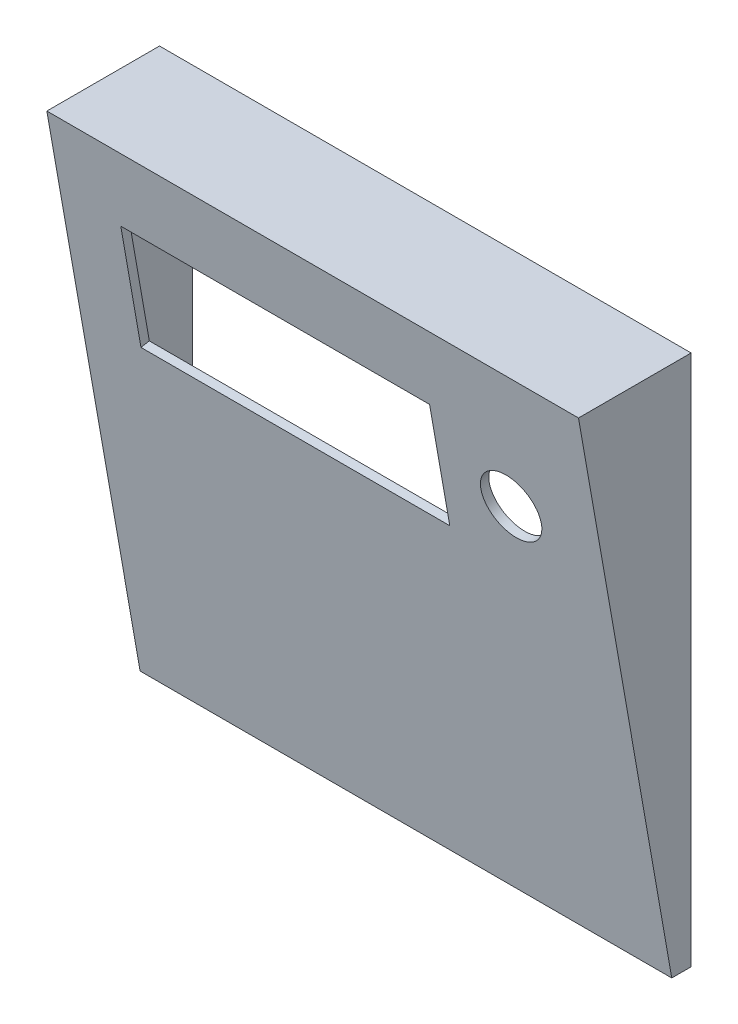
ISO-10303-21;
HEADER;
FILE_DESCRIPTION(('STEP AP214'),'2;1');
FILE_NAME('part.step','',(''),(''),'','','');
FILE_SCHEMA(('AUTOMOTIVE_DESIGN { 1 0 10303 214 1 1 1 1 }'));
ENDSEC;
DATA;
#1=APPLICATION_CONTEXT('core data for automotive mechanical design processes');
#2=APPLICATION_PROTOCOL_DEFINITION('international standard','automotive_design',2000,#1);
#3=PRODUCT_CONTEXT('',#1,'mechanical');
#4=PRODUCT('Part','Part','',(#3));
#5=PRODUCT_RELATED_PRODUCT_CATEGORY('part','',(#4));
#6=PRODUCT_DEFINITION_FORMATION('','',#4);
#7=PRODUCT_DEFINITION_CONTEXT('part definition',#1,'design');
#8=PRODUCT_DEFINITION('design','',#6,#7);
#9=PRODUCT_DEFINITION_SHAPE('','',#8);
#10=(LENGTH_UNIT() NAMED_UNIT(*) SI_UNIT(.MILLI.,.METRE.));
#11=(NAMED_UNIT(*) PLANE_ANGLE_UNIT() SI_UNIT($,.RADIAN.));
#12=(NAMED_UNIT(*) SI_UNIT($,.STERADIAN.) SOLID_ANGLE_UNIT());
#13=UNCERTAINTY_MEASURE_WITH_UNIT(LENGTH_MEASURE(1.E-05),#10,'distance_accuracy_value','');
#14=(GEOMETRIC_REPRESENTATION_CONTEXT(3) GLOBAL_UNCERTAINTY_ASSIGNED_CONTEXT((#13)) GLOBAL_UNIT_ASSIGNED_CONTEXT((#10,
#11,#12)) REPRESENTATION_CONTEXT('',''));
#15=CARTESIAN_POINT('',(0.,0.,0.));
#16=DIRECTION('',(0.,0.,1.));
#17=DIRECTION('',(1.,0.,0.));
#18=AXIS2_PLACEMENT_3D('',#15,#16,#17);
#19=CARTESIAN_POINT('',(0.,0.,20.));
#20=DIRECTION('',(1.,0.,0.));
#21=DIRECTION('',(0.,0.,-1.));
#22=AXIS2_PLACEMENT_3D('',#19,#20,#21);
#23=PLANE('',#22);
#24=DIRECTION('',(0.,0.,-1.));
#25=VECTOR('',#24,1.);
#26=CARTESIAN_POINT('',(0.,0.,20.));
#27=LINE('',#26,#25);
#28=CARTESIAN_POINT('',(0.,0.,4.6));
#29=VERTEX_POINT('',#28);
#30=CARTESIAN_POINT('',(0.,0.,1.4));
#31=VERTEX_POINT('',#30);
#32=EDGE_CURVE('E266',#29,#31,#27,.T.);
#33=ORIENTED_EDGE('',*,*,#32,.F.);
#34=DIRECTION('',(0.,0.984963723377923,0.172761290888611));
#35=VECTOR('',#34,1.);
#36=CARTESIAN_POINT('',(0.,87.8,20.));
#37=LINE('',#36,#35);
#38=CARTESIAN_POINT('',(0.,87.8,20.));
#39=VERTEX_POINT('',#38);
#40=EDGE_CURVE('E207',#29,#39,#37,.T.);
#41=ORIENTED_EDGE('',*,*,#40,.T.);
#42=DIRECTION('',(0.,0.,-1.));
#43=VECTOR('',#42,1.);
#44=CARTESIAN_POINT('',(0.,87.8,20.));
#45=LINE('',#44,#43);
#46=CARTESIAN_POINT('',(0.,87.8,1.4));
#47=VERTEX_POINT('',#46);
#48=EDGE_CURVE('E258',#39,#47,#45,.T.);
#49=ORIENTED_EDGE('',*,*,#48,.T.);
#50=DIRECTION('',(0.,1.,0.));
#51=VECTOR('',#50,1.);
#52=CARTESIAN_POINT('',(0.,87.8,1.4));
#53=LINE('',#52,#51);
#54=EDGE_CURVE('E252',#31,#47,#53,.T.);
#55=ORIENTED_EDGE('',*,*,#54,.F.);
#56=EDGE_LOOP('',(#33,#41,#49,#55));
#57=FACE_BOUND('',#56,.T.);
#58=ADVANCED_FACE('F35',(#57),#23,.F.);
#59=CARTESIAN_POINT('',(0.,0.,20.));
#60=DIRECTION('',(0.,1.,0.));
#61=DIRECTION('',(0.,0.,1.));
#62=AXIS2_PLACEMENT_3D('',#59,#60,#61);
#63=PLANE('',#62);
#64=DIRECTION('',(0.,0.,-1.));
#65=VECTOR('',#64,1.);
#66=CARTESIAN_POINT('',(87.8,0.,20.));
#67=LINE('',#66,#65);
#68=CARTESIAN_POINT('',(87.8,0.,4.6));
#69=VERTEX_POINT('',#68);
#70=CARTESIAN_POINT('',(87.8,0.,1.4));
#71=VERTEX_POINT('',#70);
#72=EDGE_CURVE('E264',#69,#71,#67,.T.);
#73=ORIENTED_EDGE('',*,*,#72,.F.);
#74=DIRECTION('',(1.,0.,0.));
#75=VECTOR('',#74,1.);
#76=CARTESIAN_POINT('',(0.,0.,4.6));
#77=LINE('',#76,#75);
#78=EDGE_CURVE('E210',#29,#69,#77,.T.);
#79=ORIENTED_EDGE('',*,*,#78,.F.);
#80=ORIENTED_EDGE('',*,*,#32,.T.);
#81=DIRECTION('',(-1.,0.,0.));
#82=VECTOR('',#81,1.);
#83=CARTESIAN_POINT('',(87.8,0.,1.4));
#84=LINE('',#83,#82);
#85=EDGE_CURVE('E249',#71,#31,#84,.T.);
#86=ORIENTED_EDGE('',*,*,#85,.F.);
#87=EDGE_LOOP('',(#73,#79,#80,#86));
#88=FACE_BOUND('',#87,.T.);
#89=ADVANCED_FACE('F293',(#88),#63,.F.);
#90=CARTESIAN_POINT('',(87.8,0.,20.));
#91=DIRECTION('',(-1.,0.,0.));
#92=DIRECTION('',(0.,0.,1.));
#93=AXIS2_PLACEMENT_3D('',#90,#91,#92);
#94=PLANE('',#93);
#95=DIRECTION('',(0.,0.,-1.));
#96=VECTOR('',#95,1.);
#97=CARTESIAN_POINT('',(87.8,87.8,20.));
#98=LINE('',#97,#96);
#99=CARTESIAN_POINT('',(87.8,87.8,20.));
#100=VERTEX_POINT('',#99);
#101=CARTESIAN_POINT('',(87.8,87.8,1.4));
#102=VERTEX_POINT('',#101);
#103=EDGE_CURVE('E261',#100,#102,#98,.T.);
#104=ORIENTED_EDGE('',*,*,#103,.F.);
#105=DIRECTION('',(0.,0.984963723377923,0.172761290888611));
#106=VECTOR('',#105,1.);
#107=CARTESIAN_POINT('',(87.8,87.8,20.));
#108=LINE('',#107,#106);
#109=EDGE_CURVE('E206',#69,#100,#108,.T.);
#110=ORIENTED_EDGE('',*,*,#109,.F.);
#111=ORIENTED_EDGE('',*,*,#72,.T.);
#112=DIRECTION('',(0.,-1.,0.));
#113=VECTOR('',#112,1.);
#114=CARTESIAN_POINT('',(87.8,87.8,1.4));
#115=LINE('',#114,#113);
#116=EDGE_CURVE('E240',#102,#71,#115,.T.);
#117=ORIENTED_EDGE('',*,*,#116,.F.);
#118=EDGE_LOOP('',(#104,#110,#111,#117));
#119=FACE_BOUND('',#118,.T.);
#120=ADVANCED_FACE('F298',(#119),#94,.F.);
#121=CARTESIAN_POINT('',(0.,87.8,20.));
#122=DIRECTION('',(0.,-1.,0.));
#123=DIRECTION('',(0.,0.,-1.));
#124=AXIS2_PLACEMENT_3D('',#121,#122,#123);
#125=PLANE('',#124);
#126=DIRECTION('',(1.,0.,0.));
#127=VECTOR('',#126,1.);
#128=CARTESIAN_POINT('',(87.8,87.8,1.4));
#129=LINE('',#128,#127);
#130=EDGE_CURVE('E254',#47,#102,#129,.T.);
#131=ORIENTED_EDGE('',*,*,#130,.F.);
#132=ORIENTED_EDGE('',*,*,#48,.F.);
#133=DIRECTION('',(-1.,0.,0.));
#134=VECTOR('',#133,1.);
#135=CARTESIAN_POINT('',(0.,87.8,20.));
#136=LINE('',#135,#134);
#137=EDGE_CURVE('E256',#100,#39,#136,.T.);
#138=ORIENTED_EDGE('',*,*,#137,.F.);
#139=ORIENTED_EDGE('',*,*,#103,.T.);
#140=EDGE_LOOP('',(#131,#132,#138,#139));
#141=FACE_BOUND('',#140,.T.);
#142=ADVANCED_FACE('F315',(#141),#125,.F.);
#143=CARTESIAN_POINT('',(0.,0.,1.4));
#144=DIRECTION('',(0.,0.,-1.));
#145=DIRECTION('',(-1.,0.,0.));
#146=AXIS2_PLACEMENT_3D('',#143,#144,#145);
#147=PLANE('',#146);
#148=DIRECTION('',(1.,0.,0.));
#149=VECTOR('',#148,1.);
#150=CARTESIAN_POINT('',(86.15,86.15,1.4));
#151=LINE('',#150,#149);
#152=CARTESIAN_POINT('',(1.65,86.15,1.4));
#153=VERTEX_POINT('',#152);
#154=CARTESIAN_POINT('',(86.15,86.15,1.4));
#155=VERTEX_POINT('',#154);
#156=EDGE_CURVE('E224',#153,#155,#151,.T.);
#157=ORIENTED_EDGE('',*,*,#156,.F.);
#158=DIRECTION('',(0.,1.,0.));
#159=VECTOR('',#158,1.);
#160=CARTESIAN_POINT('',(1.65,86.15,1.4));
#161=LINE('',#160,#159);
#162=CARTESIAN_POINT('',(1.65,1.65,1.4));
#163=VERTEX_POINT('',#162);
#164=EDGE_CURVE('E221',#163,#153,#161,.T.);
#165=ORIENTED_EDGE('',*,*,#164,.F.);
#166=DIRECTION('',(-1.,0.,0.));
#167=VECTOR('',#166,1.);
#168=CARTESIAN_POINT('',(86.15,1.65,1.4));
#169=LINE('',#168,#167);
#170=CARTESIAN_POINT('',(86.15,1.65,1.4));
#171=VERTEX_POINT('',#170);
#172=EDGE_CURVE('E217',#171,#163,#169,.T.);
#173=ORIENTED_EDGE('',*,*,#172,.F.);
#174=DIRECTION('',(0.,-1.,0.));
#175=VECTOR('',#174,1.);
#176=CARTESIAN_POINT('',(86.15,86.15,1.4));
#177=LINE('',#176,#175);
#178=EDGE_CURVE('E214',#155,#171,#177,.T.);
#179=ORIENTED_EDGE('',*,*,#178,.F.);
#180=EDGE_LOOP('',(#157,#165,#173,#179));
#181=FACE_BOUND('',#180,.T.);
#182=ORIENTED_EDGE('',*,*,#116,.T.);
#183=ORIENTED_EDGE('',*,*,#85,.T.);
#184=ORIENTED_EDGE('',*,*,#54,.T.);
#185=ORIENTED_EDGE('',*,*,#130,.T.);
#186=EDGE_LOOP('',(#182,#183,#184,#185));
#187=FACE_BOUND('',#186,.T.);
#188=ADVANCED_FACE('F307',(#181,#187),#147,.T.);
#189=CARTESIAN_POINT('',(86.15,86.15,1.4));
#190=DIRECTION('',(1.,0.,0.));
#191=DIRECTION('',(0.,0.,-1.));
#192=AXIS2_PLACEMENT_3D('',#189,#190,#191);
#193=PLANE('',#192);
#194=DIRECTION('',(0.,-1.,0.));
#195=VECTOR('',#194,1.);
#196=CARTESIAN_POINT('',(86.15,86.15,0.));
#197=LINE('',#196,#195);
#198=CARTESIAN_POINT('',(86.15,86.15,0.));
#199=VERTEX_POINT('',#198);
#200=CARTESIAN_POINT('',(86.15,1.65,0.));
#201=VERTEX_POINT('',#200);
#202=EDGE_CURVE('E213',#199,#201,#197,.T.);
#203=ORIENTED_EDGE('',*,*,#202,.F.);
#204=DIRECTION('',(0.,0.,-1.));
#205=VECTOR('',#204,1.);
#206=CARTESIAN_POINT('',(86.15,86.15,1.4));
#207=LINE('',#206,#205);
#208=EDGE_CURVE('E238',#155,#199,#207,.T.);
#209=ORIENTED_EDGE('',*,*,#208,.F.);
#210=ORIENTED_EDGE('',*,*,#178,.T.);
#211=DIRECTION('',(0.,0.,-1.));
#212=VECTOR('',#211,1.);
#213=CARTESIAN_POINT('',(86.15,1.65,1.4));
#214=LINE('',#213,#212);
#215=EDGE_CURVE('E227',#171,#201,#214,.T.);
#216=ORIENTED_EDGE('',*,*,#215,.T.);
#217=EDGE_LOOP('',(#203,#209,#210,#216));
#218=FACE_BOUND('',#217,.T.);
#219=ADVANCED_FACE('F339',(#218),#193,.T.);
#220=CARTESIAN_POINT('',(86.15,86.15,1.4));
#221=DIRECTION('',(0.,1.,0.));
#222=DIRECTION('',(0.,0.,1.));
#223=AXIS2_PLACEMENT_3D('',#220,#221,#222);
#224=PLANE('',#223);
#225=DIRECTION('',(1.,0.,0.));
#226=VECTOR('',#225,1.);
#227=CARTESIAN_POINT('',(86.15,86.15,0.));
#228=LINE('',#227,#226);
#229=CARTESIAN_POINT('',(1.65,86.15,0.));
#230=VERTEX_POINT('',#229);
#231=EDGE_CURVE('E218',#230,#199,#228,.T.);
#232=ORIENTED_EDGE('',*,*,#231,.F.);
#233=DIRECTION('',(0.,0.,-1.));
#234=VECTOR('',#233,1.);
#235=CARTESIAN_POINT('',(1.65,86.15,1.4));
#236=LINE('',#235,#234);
#237=EDGE_CURVE('E241',#153,#230,#236,.T.);
#238=ORIENTED_EDGE('',*,*,#237,.F.);
#239=ORIENTED_EDGE('',*,*,#156,.T.);
#240=ORIENTED_EDGE('',*,*,#208,.T.);
#241=EDGE_LOOP('',(#232,#238,#239,#240));
#242=FACE_BOUND('',#241,.T.);
#243=ADVANCED_FACE('F335',(#242),#224,.T.);
#244=CARTESIAN_POINT('',(1.65,86.15,1.4));
#245=DIRECTION('',(-1.,0.,0.));
#246=DIRECTION('',(0.,-1.,0.));
#247=AXIS2_PLACEMENT_3D('',#244,#245,#246);
#248=PLANE('',#247);
#249=DIRECTION('',(0.,1.,0.));
#250=VECTOR('',#249,1.);
#251=CARTESIAN_POINT('',(1.65,86.15,0.));
#252=LINE('',#251,#250);
#253=CARTESIAN_POINT('',(1.65,1.65,0.));
#254=VERTEX_POINT('',#253);
#255=EDGE_CURVE('E233',#254,#230,#252,.T.);
#256=ORIENTED_EDGE('',*,*,#255,.F.);
#257=DIRECTION('',(0.,0.,-1.));
#258=VECTOR('',#257,1.);
#259=CARTESIAN_POINT('',(1.65,1.65,1.4));
#260=LINE('',#259,#258);
#261=EDGE_CURVE('E243',#163,#254,#260,.T.);
#262=ORIENTED_EDGE('',*,*,#261,.F.);
#263=ORIENTED_EDGE('',*,*,#164,.T.);
#264=ORIENTED_EDGE('',*,*,#237,.T.);
#265=EDGE_LOOP('',(#256,#262,#263,#264));
#266=FACE_BOUND('',#265,.T.);
#267=ADVANCED_FACE('F338',(#266),#248,.T.);
#268=CARTESIAN_POINT('',(86.15,1.65,1.4));
#269=DIRECTION('',(0.,-1.,0.));
#270=DIRECTION('',(1.,0.,0.));
#271=AXIS2_PLACEMENT_3D('',#268,#269,#270);
#272=PLANE('',#271);
#273=DIRECTION('',(-1.,0.,0.));
#274=VECTOR('',#273,1.);
#275=CARTESIAN_POINT('',(86.15,1.65,0.));
#276=LINE('',#275,#274);
#277=EDGE_CURVE('E230',#201,#254,#276,.T.);
#278=ORIENTED_EDGE('',*,*,#277,.F.);
#279=ORIENTED_EDGE('',*,*,#215,.F.);
#280=ORIENTED_EDGE('',*,*,#172,.T.);
#281=ORIENTED_EDGE('',*,*,#261,.T.);
#282=EDGE_LOOP('',(#278,#279,#280,#281));
#283=FACE_BOUND('',#282,.T.);
#284=ADVANCED_FACE('F330',(#283),#272,.T.);
#285=CARTESIAN_POINT('',(0.,0.,0.));
#286=DIRECTION('',(0.,0.,-1.));
#287=DIRECTION('',(-1.,0.,0.));
#288=AXIS2_PLACEMENT_3D('',#285,#286,#287);
#289=PLANE('',#288);
#290=DIRECTION('',(1.,0.,0.));
#291=VECTOR('',#290,1.);
#292=CARTESIAN_POINT('',(83.75,83.75,0.));
#293=LINE('',#292,#291);
#294=CARTESIAN_POINT('',(4.05,83.75,0.));
#295=VERTEX_POINT('',#294);
#296=CARTESIAN_POINT('',(83.75,83.75,0.));
#297=VERTEX_POINT('',#296);
#298=EDGE_CURVE('E186',#295,#297,#293,.T.);
#299=ORIENTED_EDGE('',*,*,#298,.F.);
#300=DIRECTION('',(0.,1.,0.));
#301=VECTOR('',#300,1.);
#302=CARTESIAN_POINT('',(4.05,83.75,0.));
#303=LINE('',#302,#301);
#304=CARTESIAN_POINT('',(4.05,4.05,0.));
#305=VERTEX_POINT('',#304);
#306=EDGE_CURVE('E194',#305,#295,#303,.T.);
#307=ORIENTED_EDGE('',*,*,#306,.F.);
#308=DIRECTION('',(-1.,0.,0.));
#309=VECTOR('',#308,1.);
#310=CARTESIAN_POINT('',(83.75,4.05,0.));
#311=LINE('',#310,#309);
#312=CARTESIAN_POINT('',(83.75,4.05,0.));
#313=VERTEX_POINT('',#312);
#314=EDGE_CURVE('E191',#313,#305,#311,.T.);
#315=ORIENTED_EDGE('',*,*,#314,.F.);
#316=DIRECTION('',(0.,-1.,0.));
#317=VECTOR('',#316,1.);
#318=CARTESIAN_POINT('',(83.75,83.75,0.));
#319=LINE('',#318,#317);
#320=EDGE_CURVE('E188',#297,#313,#319,.T.);
#321=ORIENTED_EDGE('',*,*,#320,.F.);
#322=EDGE_LOOP('',(#299,#307,#315,#321));
#323=FACE_BOUND('',#322,.T.);
#324=ORIENTED_EDGE('',*,*,#231,.T.);
#325=ORIENTED_EDGE('',*,*,#202,.T.);
#326=ORIENTED_EDGE('',*,*,#277,.T.);
#327=ORIENTED_EDGE('',*,*,#255,.T.);
#328=EDGE_LOOP('',(#324,#325,#326,#327));
#329=FACE_BOUND('',#328,.T.);
#330=ADVANCED_FACE('F319',(#323,#329),#289,.T.);
#331=CARTESIAN_POINT('',(0.,87.8,20.));
#332=DIRECTION('',(0.,0.172761290888611,-0.984963723377923));
#333=DIRECTION('',(0.,0.984963723377923,0.172761290888611));
#334=AXIS2_PLACEMENT_3D('',#331,#332,#333);
#335=PLANE('',#334);
#336=DIRECTION('',(1.,0.,0.));
#337=VECTOR('',#336,1.);
#338=CARTESIAN_POINT('',(10.,56.2199598420951,14.4609041180896));
#339=LINE('',#338,#337);
#340=CARTESIAN_POINT('',(10.,56.2199598420951,14.4609041180896));
#341=VERTEX_POINT('',#340);
#342=CARTESIAN_POINT('',(61.,56.2199598420951,14.4609041180896));
#343=VERTEX_POINT('',#342);
#344=EDGE_CURVE('E158',#341,#343,#339,.T.);
#345=ORIENTED_EDGE('',*,*,#344,.F.);
#346=DIRECTION('',(0.,-0.984963723377923,-0.172761290888611));
#347=VECTOR('',#346,1.);
#348=CARTESIAN_POINT('',(10.,75.2336995581825,17.7958880774033));
#349=LINE('',#348,#347);
#350=CARTESIAN_POINT('',(10.,75.2336995581825,17.7958880774033));
#351=VERTEX_POINT('',#350);
#352=EDGE_CURVE('E49',#351,#341,#349,.T.);
#353=ORIENTED_EDGE('',*,*,#352,.F.);
#354=DIRECTION('',(-1.,0.,0.));
#355=VECTOR('',#354,1.);
#356=CARTESIAN_POINT('',(10.,75.2336995581825,17.7958880774033));
#357=LINE('',#356,#355);
#358=CARTESIAN_POINT('',(61.,75.2336995581825,17.7958880774033));
#359=VERTEX_POINT('',#358);
#360=EDGE_CURVE('E165',#359,#351,#357,.T.);
#361=ORIENTED_EDGE('',*,*,#360,.F.);
#362=DIRECTION('',(0.,0.984963723377923,0.172761290888611));
#363=VECTOR('',#362,1.);
#364=CARTESIAN_POINT('',(61.,75.2336995581825,17.7958880774033));
#365=LINE('',#364,#363);
#366=EDGE_CURVE('E149',#343,#359,#365,.T.);
#367=ORIENTED_EDGE('',*,*,#366,.F.);
#368=EDGE_LOOP('',(#345,#353,#361,#367));
#369=FACE_BOUND('',#368,.T.);
#370=CARTESIAN_POINT('',(72.8,65.7268297001388,16.1283960977464));
#371=DIRECTION('',(0.,-0.172761290888611,0.984963723377923));
#372=DIRECTION('',(0.,-0.984963723377923,-0.172761290888611));
#373=AXIS2_PLACEMENT_3D('',#370,#371,#372);
#374=CIRCLE('',#373,5.00000000000001);
#375=CARTESIAN_POINT('',(72.8,60.8020110832492,15.2645896433034));
#376=VERTEX_POINT('',#375);
#377=EDGE_CURVE('E175',#376,#376,#374,.T.);
#378=ORIENTED_EDGE('',*,*,#377,.F.);
#379=EDGE_LOOP('',(#378));
#380=FACE_BOUND('',#379,.T.);
#381=ORIENTED_EDGE('',*,*,#109,.T.);
#382=ORIENTED_EDGE('',*,*,#137,.T.);
#383=ORIENTED_EDGE('',*,*,#40,.F.);
#384=ORIENTED_EDGE('',*,*,#78,.T.);
#385=EDGE_LOOP('',(#381,#382,#383,#384));
#386=FACE_BOUND('',#385,.T.);
#387=ADVANCED_FACE('F162',(#369,#380,#386),#335,.F.);
#388=CARTESIAN_POINT('',(83.75,83.75,125.85177546355));
#389=DIRECTION('',(0.,1.,0.));
#390=DIRECTION('',(0.,0.,1.));
#391=AXIS2_PLACEMENT_3D('',#388,#389,#390);
#392=PLANE('',#391);
#393=DIRECTION('',(-1.,0.,0.));
#394=VECTOR('',#393,1.);
#395=CARTESIAN_POINT('',(83.75,83.75,17.8682633905561));
#396=LINE('',#395,#394);
#397=CARTESIAN_POINT('',(83.75,83.75,17.8682633905561));
#398=VERTEX_POINT('',#397);
#399=CARTESIAN_POINT('',(4.05,83.75,17.8682633905561));
#400=VERTEX_POINT('',#399);
#401=EDGE_CURVE('E183',#398,#400,#396,.T.);
#402=ORIENTED_EDGE('',*,*,#401,.T.);
#403=DIRECTION('',(0.,0.,-1.));
#404=VECTOR('',#403,1.);
#405=CARTESIAN_POINT('',(4.05,83.75,125.85177546355));
#406=LINE('',#405,#404);
#407=EDGE_CURVE('E181',#400,#295,#406,.T.);
#408=ORIENTED_EDGE('',*,*,#407,.T.);
#409=ORIENTED_EDGE('',*,*,#298,.T.);
#410=DIRECTION('',(0.,0.,-1.));
#411=VECTOR('',#410,1.);
#412=CARTESIAN_POINT('',(83.75,83.75,125.85177546355));
#413=LINE('',#412,#411);
#414=EDGE_CURVE('E197',#398,#297,#413,.T.);
#415=ORIENTED_EDGE('',*,*,#414,.F.);
#416=EDGE_LOOP('',(#402,#408,#409,#415));
#417=FACE_BOUND('',#416,.T.);
#418=ADVANCED_FACE('F318',(#417),#392,.F.);
#419=CARTESIAN_POINT('',(4.05,83.75,125.85177546355));
#420=DIRECTION('',(-1.,0.,0.));
#421=DIRECTION('',(0.,-1.,0.));
#422=AXIS2_PLACEMENT_3D('',#419,#420,#421);
#423=PLANE('',#422);
#424=DIRECTION('',(0.,-0.984963723377923,-0.172761290888611));
#425=VECTOR('',#424,1.);
#426=CARTESIAN_POINT('',(4.05,102.124863622469,21.0911893562283));
#427=LINE('',#426,#425);
#428=CARTESIAN_POINT('',(4.05,4.05,3.88899231994109));
#429=VERTEX_POINT('',#428);
#430=EDGE_CURVE('E180',#400,#429,#427,.T.);
#431=ORIENTED_EDGE('',*,*,#430,.T.);
#432=DIRECTION('',(0.,0.,-1.));
#433=VECTOR('',#432,1.);
#434=CARTESIAN_POINT('',(4.05,4.05,125.85177546355));
#435=LINE('',#434,#433);
#436=EDGE_CURVE('E199',#429,#305,#435,.T.);
#437=ORIENTED_EDGE('',*,*,#436,.T.);
#438=ORIENTED_EDGE('',*,*,#306,.T.);
#439=ORIENTED_EDGE('',*,*,#407,.F.);
#440=EDGE_LOOP('',(#431,#437,#438,#439));
#441=FACE_BOUND('',#440,.T.);
#442=ADVANCED_FACE('F326',(#441),#423,.F.);
#443=CARTESIAN_POINT('',(83.75,4.05,125.85177546355));
#444=DIRECTION('',(0.,-1.,0.));
#445=DIRECTION('',(1.,0.,0.));
#446=AXIS2_PLACEMENT_3D('',#443,#444,#445);
#447=PLANE('',#446);
#448=DIRECTION('',(1.,0.,0.));
#449=VECTOR('',#448,1.);
#450=CARTESIAN_POINT('',(83.75,4.05,3.8889923199411));
#451=LINE('',#450,#449);
#452=CARTESIAN_POINT('',(83.75,4.04999999999999,3.88899231994111));
#453=VERTEX_POINT('',#452);
#454=EDGE_CURVE('E178',#429,#453,#451,.T.);
#455=ORIENTED_EDGE('',*,*,#454,.T.);
#456=DIRECTION('',(0.,0.,-1.));
#457=VECTOR('',#456,1.);
#458=CARTESIAN_POINT('',(83.75,4.05,125.85177546355));
#459=LINE('',#458,#457);
#460=EDGE_CURVE('E201',#453,#313,#459,.T.);
#461=ORIENTED_EDGE('',*,*,#460,.T.);
#462=ORIENTED_EDGE('',*,*,#314,.T.);
#463=ORIENTED_EDGE('',*,*,#436,.F.);
#464=EDGE_LOOP('',(#455,#461,#462,#463));
#465=FACE_BOUND('',#464,.T.);
#466=ADVANCED_FACE('F402',(#465),#447,.F.);
#467=CARTESIAN_POINT('',(83.75,83.75,125.85177546355));
#468=DIRECTION('',(1.,0.,0.));
#469=DIRECTION('',(0.,0.,-1.));
#470=AXIS2_PLACEMENT_3D('',#467,#468,#469);
#471=PLANE('',#470);
#472=DIRECTION('',(0.,0.984963723377923,0.172761290888611));
#473=VECTOR('',#472,1.);
#474=CARTESIAN_POINT('',(83.75,102.124863622469,21.0911893562283));
#475=LINE('',#474,#473);
#476=EDGE_CURVE('E185',#453,#398,#475,.T.);
#477=ORIENTED_EDGE('',*,*,#476,.T.);
#478=ORIENTED_EDGE('',*,*,#414,.T.);
#479=ORIENTED_EDGE('',*,*,#320,.T.);
#480=ORIENTED_EDGE('',*,*,#460,.F.);
#481=EDGE_LOOP('',(#477,#478,#479,#480));
#482=FACE_BOUND('',#481,.T.);
#483=ADVANCED_FACE('F410',(#482),#471,.F.);
#484=CARTESIAN_POINT('',(0.,88.0418658072441,18.6210507872709));
#485=DIRECTION('',(0.,0.172761290888611,-0.984963723377923));
#486=DIRECTION('',(0.,0.984963723377923,0.172761290888611));
#487=AXIS2_PLACEMENT_3D('',#484,#485,#486);
#488=PLANE('',#487);
#489=DIRECTION('',(0.,0.984963723377923,0.172761290888611));
#490=VECTOR('',#489,1.);
#491=CARTESIAN_POINT('',(10.,88.0418658072441,18.6210507872709));
#492=LINE('',#491,#490);
#493=CARTESIAN_POINT('',(10.,56.4618256493391,13.0819549053605));
#494=VERTEX_POINT('',#493);
#495=CARTESIAN_POINT('',(10.,75.4755653654266,16.4169388646742));
#496=VERTEX_POINT('',#495);
#497=EDGE_CURVE('E12',#494,#496,#492,.T.);
#498=ORIENTED_EDGE('',*,*,#497,.F.);
#499=DIRECTION('',(-1.,0.,0.));
#500=VECTOR('',#499,1.);
#501=CARTESIAN_POINT('',(0.,56.4618256493391,13.0819549053605));
#502=LINE('',#501,#500);
#503=CARTESIAN_POINT('',(61.,56.4618256493391,13.0819549053605));
#504=VERTEX_POINT('',#503);
#505=EDGE_CURVE('E268',#504,#494,#502,.T.);
#506=ORIENTED_EDGE('',*,*,#505,.F.);
#507=DIRECTION('',(0.,-0.984963723377923,-0.172761290888611));
#508=VECTOR('',#507,1.);
#509=CARTESIAN_POINT('',(61.,88.0418658072441,18.6210507872709));
#510=LINE('',#509,#508);
#511=CARTESIAN_POINT('',(61.,75.4755653654266,16.4169388646742));
#512=VERTEX_POINT('',#511);
#513=EDGE_CURVE('E152',#512,#504,#510,.T.);
#514=ORIENTED_EDGE('',*,*,#513,.F.);
#515=DIRECTION('',(1.,0.,0.));
#516=VECTOR('',#515,1.);
#517=CARTESIAN_POINT('',(0.,75.4755653654266,16.4169388646742));
#518=LINE('',#517,#516);
#519=EDGE_CURVE('E42',#496,#512,#518,.T.);
#520=ORIENTED_EDGE('',*,*,#519,.F.);
#521=EDGE_LOOP('',(#498,#506,#514,#520));
#522=FACE_BOUND('',#521,.T.);
#523=CARTESIAN_POINT('',(72.8,65.9686955073828,14.7494468850173));
#524=DIRECTION('',(0.,0.172761290888611,-0.984963723377923));
#525=DIRECTION('',(0.,0.984963723377923,0.172761290888611));
#526=AXIS2_PLACEMENT_3D('',#523,#524,#525);
#527=CIRCLE('',#526,5.00000000000001);
#528=CARTESIAN_POINT('',(72.8,70.8935141242725,15.6132533394604));
#529=VERTEX_POINT('',#528);
#530=EDGE_CURVE('E172',#529,#529,#527,.T.);
#531=ORIENTED_EDGE('',*,*,#530,.F.);
#532=EDGE_LOOP('',(#531));
#533=FACE_BOUND('',#532,.T.);
#534=ORIENTED_EDGE('',*,*,#401,.F.);
#535=ORIENTED_EDGE('',*,*,#476,.F.);
#536=ORIENTED_EDGE('',*,*,#454,.F.);
#537=ORIENTED_EDGE('',*,*,#430,.F.);
#538=EDGE_LOOP('',(#534,#535,#536,#537));
#539=FACE_BOUND('',#538,.T.);
#540=ADVANCED_FACE('F278',(#522,#533,#539),#488,.T.);
#541=CARTESIAN_POINT('',(72.8,69.1301017867232,-3.27467462966358));
#542=DIRECTION('',(0.,-0.172761290888611,0.984963723377923));
#543=DIRECTION('',(0.,-0.984963723377923,-0.172761290888611));
#544=AXIS2_PLACEMENT_3D('',#541,#542,#543);
#545=CYLINDRICAL_SURFACE('',#544,5.00000000000001);
#546=ORIENTED_EDGE('',*,*,#530,.T.);
#547=EDGE_LOOP('',(#546));
#548=FACE_BOUND('',#547,.T.);
#549=ORIENTED_EDGE('',*,*,#377,.T.);
#550=EDGE_LOOP('',(#549));
#551=FACE_BOUND('',#550,.T.);
#552=ADVANCED_FACE('F282',(#548,#551),#545,.F.);
#553=CARTESIAN_POINT('',(10.,78.6369716447669,-1.60718265000671));
#554=DIRECTION('',(-1.,0.,0.));
#555=DIRECTION('',(0.,-1.,0.));
#556=AXIS2_PLACEMENT_3D('',#553,#554,#555);
#557=PLANE('',#556);
#558=ORIENTED_EDGE('',*,*,#497,.T.);
#559=DIRECTION('',(0.,-0.172761290888611,0.984963723377923));
#560=VECTOR('',#559,1.);
#561=CARTESIAN_POINT('',(10.,78.6369716447669,-1.60718265000671));
#562=LINE('',#561,#560);
#563=EDGE_CURVE('E170',#496,#351,#562,.T.);
#564=ORIENTED_EDGE('',*,*,#563,.T.);
#565=ORIENTED_EDGE('',*,*,#352,.T.);
#566=DIRECTION('',(0.,-0.172761290888611,0.984963723377923));
#567=VECTOR('',#566,1.);
#568=CARTESIAN_POINT('',(10.,59.6232319286795,-4.94216660932045));
#569=LINE('',#568,#567);
#570=EDGE_CURVE('E155',#494,#341,#569,.T.);
#571=ORIENTED_EDGE('',*,*,#570,.F.);
#572=EDGE_LOOP('',(#558,#564,#565,#571));
#573=FACE_BOUND('',#572,.T.);
#574=ADVANCED_FACE('F280',(#573),#557,.F.);
#575=CARTESIAN_POINT('',(10.,78.6369716447669,-1.60718265000671));
#576=DIRECTION('',(0.,0.984963723377923,0.172761290888611));
#577=DIRECTION('',(0.,-0.172761290888611,0.984963723377923));
#578=AXIS2_PLACEMENT_3D('',#575,#576,#577);
#579=PLANE('',#578);
#580=ORIENTED_EDGE('',*,*,#519,.T.);
#581=DIRECTION('',(0.,-0.172761290888611,0.984963723377923));
#582=VECTOR('',#581,1.);
#583=CARTESIAN_POINT('',(61.,78.6369716447669,-1.60718265000671));
#584=LINE('',#583,#582);
#585=EDGE_CURVE('E154',#512,#359,#584,.T.);
#586=ORIENTED_EDGE('',*,*,#585,.T.);
#587=ORIENTED_EDGE('',*,*,#360,.T.);
#588=ORIENTED_EDGE('',*,*,#563,.F.);
#589=EDGE_LOOP('',(#580,#586,#587,#588));
#590=FACE_BOUND('',#589,.T.);
#591=ADVANCED_FACE('F275',(#590),#579,.F.);
#592=CARTESIAN_POINT('',(61.,78.6369716447669,-1.60718265000671));
#593=DIRECTION('',(1.,0.,0.));
#594=DIRECTION('',(0.,0.,-1.));
#595=AXIS2_PLACEMENT_3D('',#592,#593,#594);
#596=PLANE('',#595);
#597=ORIENTED_EDGE('',*,*,#513,.T.);
#598=DIRECTION('',(0.,-0.172761290888611,0.984963723377923));
#599=VECTOR('',#598,1.);
#600=CARTESIAN_POINT('',(61.,59.6232319286795,-4.94216660932045));
#601=LINE('',#600,#599);
#602=EDGE_CURVE('E57',#504,#343,#601,.T.);
#603=ORIENTED_EDGE('',*,*,#602,.T.);
#604=ORIENTED_EDGE('',*,*,#366,.T.);
#605=ORIENTED_EDGE('',*,*,#585,.F.);
#606=EDGE_LOOP('',(#597,#603,#604,#605));
#607=FACE_BOUND('',#606,.T.);
#608=ADVANCED_FACE('F146',(#607),#596,.F.);
#609=CARTESIAN_POINT('',(10.,59.6232319286795,-4.94216660932045));
#610=DIRECTION('',(0.,-0.984963723377923,-0.172761290888611));
#611=DIRECTION('',(0.,0.172761290888611,-0.984963723377923));
#612=AXIS2_PLACEMENT_3D('',#609,#610,#611);
#613=PLANE('',#612);
#614=ORIENTED_EDGE('',*,*,#505,.T.);
#615=ORIENTED_EDGE('',*,*,#570,.T.);
#616=ORIENTED_EDGE('',*,*,#344,.T.);
#617=ORIENTED_EDGE('',*,*,#602,.F.);
#618=EDGE_LOOP('',(#614,#615,#616,#617));
#619=FACE_BOUND('',#618,.T.);
#620=ADVANCED_FACE('F159',(#619),#613,.F.);
#621=CLOSED_SHELL('',(#58,#89,#120,#142,#188,#219,#243,#267,#284,#330,#387,#418,#442,#466,#483,
#540,#552,#574,#591,#608,#620));
#622=MANIFOLD_SOLID_BREP('B2',#621);
#623=ADVANCED_BREP_SHAPE_REPRESENTATION('',(#18,#622),#14);
#624=SHAPE_DEFINITION_REPRESENTATION(#9,#623);
ENDSEC;
END-ISO-10303-21;
